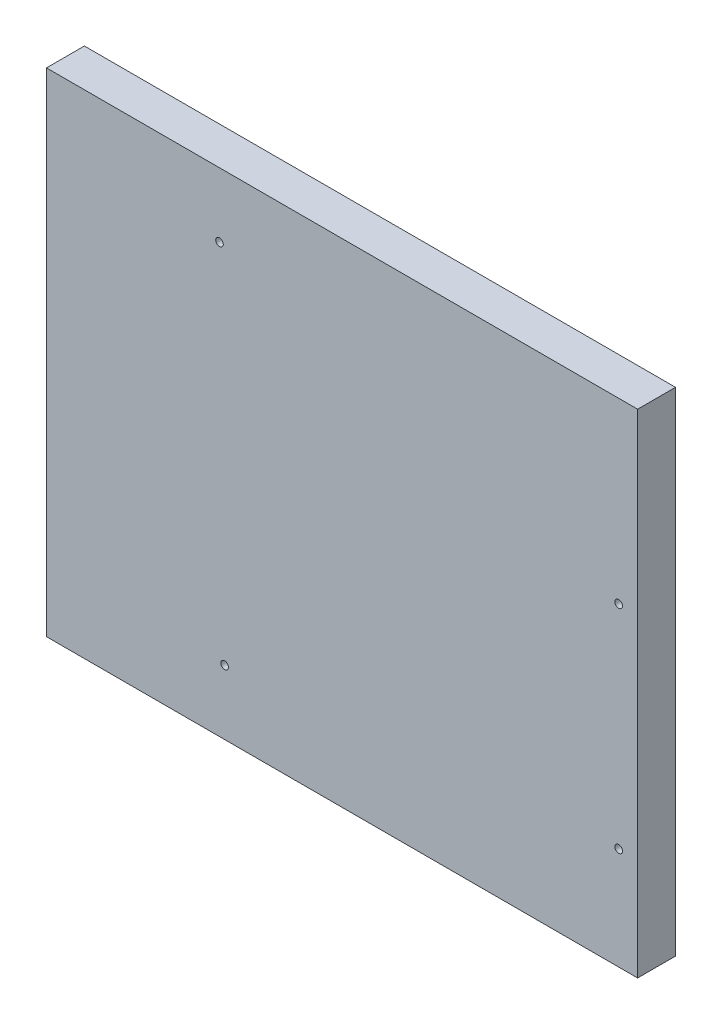
ISO-10303-21;
HEADER;
FILE_DESCRIPTION(('STEP AP214'),'2;1');
FILE_NAME('part.step','',(''),(''),'','','');
FILE_SCHEMA(('AUTOMOTIVE_DESIGN { 1 0 10303 214 1 1 1 1 }'));
ENDSEC;
DATA;
#1=APPLICATION_CONTEXT('core data for automotive mechanical design processes');
#2=APPLICATION_PROTOCOL_DEFINITION('international standard','automotive_design',2000,#1);
#3=PRODUCT_CONTEXT('',#1,'mechanical');
#4=PRODUCT('Part','Part','',(#3));
#5=PRODUCT_RELATED_PRODUCT_CATEGORY('part','',(#4));
#6=PRODUCT_DEFINITION_FORMATION('','',#4);
#7=PRODUCT_DEFINITION_CONTEXT('part definition',#1,'design');
#8=PRODUCT_DEFINITION('design','',#6,#7);
#9=PRODUCT_DEFINITION_SHAPE('','',#8);
#10=(LENGTH_UNIT() NAMED_UNIT(*) SI_UNIT(.MILLI.,.METRE.));
#11=(NAMED_UNIT(*) PLANE_ANGLE_UNIT() SI_UNIT($,.RADIAN.));
#12=(NAMED_UNIT(*) SI_UNIT($,.STERADIAN.) SOLID_ANGLE_UNIT());
#13=UNCERTAINTY_MEASURE_WITH_UNIT(LENGTH_MEASURE(1.E-05),#10,'distance_accuracy_value','');
#14=(GEOMETRIC_REPRESENTATION_CONTEXT(3) GLOBAL_UNCERTAINTY_ASSIGNED_CONTEXT((#13)) GLOBAL_UNIT_ASSIGNED_CONTEXT((#10,
#11,#12)) REPRESENTATION_CONTEXT('',''));
#15=CARTESIAN_POINT('',(0.,0.,0.));
#16=DIRECTION('',(0.,0.,1.));
#17=DIRECTION('',(1.,0.,0.));
#18=AXIS2_PLACEMENT_3D('',#15,#16,#17);
#19=CARTESIAN_POINT('',(0.,0.,5.));
#20=DIRECTION('',(1.,0.,0.));
#21=DIRECTION('',(0.,0.,-1.));
#22=AXIS2_PLACEMENT_3D('',#19,#20,#21);
#23=PLANE('',#22);
#24=DIRECTION('',(0.,-1.,0.));
#25=VECTOR('',#24,1.);
#26=CARTESIAN_POINT('',(0.,0.,0.));
#27=LINE('',#26,#25);
#28=CARTESIAN_POINT('',(0.,65.,0.));
#29=VERTEX_POINT('',#28);
#30=CARTESIAN_POINT('',(0.,0.,0.));
#31=VERTEX_POINT('',#30);
#32=EDGE_CURVE('E99',#29,#31,#27,.T.);
#33=ORIENTED_EDGE('',*,*,#32,.T.);
#34=DIRECTION('',(0.,0.,-1.));
#35=VECTOR('',#34,1.);
#36=CARTESIAN_POINT('',(0.,0.,5.));
#37=LINE('',#36,#35);
#38=CARTESIAN_POINT('',(0.,0.,5.));
#39=VERTEX_POINT('',#38);
#40=EDGE_CURVE('E11',#39,#31,#37,.T.);
#41=ORIENTED_EDGE('',*,*,#40,.F.);
#42=DIRECTION('',(0.,-1.,0.));
#43=VECTOR('',#42,1.);
#44=CARTESIAN_POINT('',(0.,0.,5.));
#45=LINE('',#44,#43);
#46=CARTESIAN_POINT('',(0.,65.,5.));
#47=VERTEX_POINT('',#46);
#48=EDGE_CURVE('E86',#47,#39,#45,.T.);
#49=ORIENTED_EDGE('',*,*,#48,.F.);
#50=DIRECTION('',(0.,0.,-1.));
#51=VECTOR('',#50,1.);
#52=CARTESIAN_POINT('',(0.,65.,5.));
#53=LINE('',#52,#51);
#54=EDGE_CURVE('E95',#47,#29,#53,.T.);
#55=ORIENTED_EDGE('',*,*,#54,.T.);
#56=EDGE_LOOP('',(#33,#41,#49,#55));
#57=FACE_BOUND('',#56,.T.);
#58=ADVANCED_FACE('F33',(#57),#23,.F.);
#59=CARTESIAN_POINT('',(0.,0.,5.));
#60=DIRECTION('',(0.,1.,0.));
#61=DIRECTION('',(0.,0.,1.));
#62=AXIS2_PLACEMENT_3D('',#59,#60,#61);
#63=PLANE('',#62);
#64=DIRECTION('',(1.,0.,0.));
#65=VECTOR('',#64,1.);
#66=CARTESIAN_POINT('',(0.,0.,0.));
#67=LINE('',#66,#65);
#68=CARTESIAN_POINT('',(78.,0.,0.));
#69=VERTEX_POINT('',#68);
#70=EDGE_CURVE('E90',#31,#69,#67,.T.);
#71=ORIENTED_EDGE('',*,*,#70,.T.);
#72=DIRECTION('',(0.,0.,-1.));
#73=VECTOR('',#72,1.);
#74=CARTESIAN_POINT('',(78.,0.,5.));
#75=LINE('',#74,#73);
#76=CARTESIAN_POINT('',(78.,0.,5.));
#77=VERTEX_POINT('',#76);
#78=EDGE_CURVE('E42',#77,#69,#75,.T.);
#79=ORIENTED_EDGE('',*,*,#78,.F.);
#80=DIRECTION('',(1.,0.,0.));
#81=VECTOR('',#80,1.);
#82=CARTESIAN_POINT('',(0.,0.,5.));
#83=LINE('',#82,#81);
#84=EDGE_CURVE('E81',#39,#77,#83,.T.);
#85=ORIENTED_EDGE('',*,*,#84,.F.);
#86=ORIENTED_EDGE('',*,*,#40,.T.);
#87=EDGE_LOOP('',(#71,#79,#85,#86));
#88=FACE_BOUND('',#87,.T.);
#89=ADVANCED_FACE('F89',(#88),#63,.F.);
#90=CARTESIAN_POINT('',(78.,0.,5.));
#91=DIRECTION('',(-1.,0.,0.));
#92=DIRECTION('',(0.,0.,1.));
#93=AXIS2_PLACEMENT_3D('',#90,#91,#92);
#94=PLANE('',#93);
#95=DIRECTION('',(0.,1.,0.));
#96=VECTOR('',#95,1.);
#97=CARTESIAN_POINT('',(78.,0.,0.));
#98=LINE('',#97,#96);
#99=CARTESIAN_POINT('',(78.,65.,0.));
#100=VERTEX_POINT('',#99);
#101=EDGE_CURVE('E68',#69,#100,#98,.T.);
#102=ORIENTED_EDGE('',*,*,#101,.T.);
#103=DIRECTION('',(0.,0.,-1.));
#104=VECTOR('',#103,1.);
#105=CARTESIAN_POINT('',(78.,65.,5.));
#106=LINE('',#105,#104);
#107=CARTESIAN_POINT('',(78.,65.,5.));
#108=VERTEX_POINT('',#107);
#109=EDGE_CURVE('E91',#108,#100,#106,.T.);
#110=ORIENTED_EDGE('',*,*,#109,.F.);
#111=DIRECTION('',(0.,1.,0.));
#112=VECTOR('',#111,1.);
#113=CARTESIAN_POINT('',(78.,0.,5.));
#114=LINE('',#113,#112);
#115=EDGE_CURVE('E84',#77,#108,#114,.T.);
#116=ORIENTED_EDGE('',*,*,#115,.F.);
#117=ORIENTED_EDGE('',*,*,#78,.T.);
#118=EDGE_LOOP('',(#102,#110,#116,#117));
#119=FACE_BOUND('',#118,.T.);
#120=ADVANCED_FACE('F93',(#119),#94,.F.);
#121=CARTESIAN_POINT('',(0.,65.,5.));
#122=DIRECTION('',(0.,-1.,0.));
#123=DIRECTION('',(0.,0.,-1.));
#124=AXIS2_PLACEMENT_3D('',#121,#122,#123);
#125=PLANE('',#124);
#126=DIRECTION('',(-1.,0.,0.));
#127=VECTOR('',#126,1.);
#128=CARTESIAN_POINT('',(0.,65.,0.));
#129=LINE('',#128,#127);
#130=EDGE_CURVE('E74',#100,#29,#129,.T.);
#131=ORIENTED_EDGE('',*,*,#130,.T.);
#132=ORIENTED_EDGE('',*,*,#54,.F.);
#133=DIRECTION('',(-1.,0.,0.));
#134=VECTOR('',#133,1.);
#135=CARTESIAN_POINT('',(0.,65.,5.));
#136=LINE('',#135,#134);
#137=EDGE_CURVE('E51',#108,#47,#136,.T.);
#138=ORIENTED_EDGE('',*,*,#137,.F.);
#139=ORIENTED_EDGE('',*,*,#109,.T.);
#140=EDGE_LOOP('',(#131,#132,#138,#139));
#141=FACE_BOUND('',#140,.T.);
#142=ADVANCED_FACE('F136',(#141),#125,.F.);
#143=CARTESIAN_POINT('',(0.,0.,5.));
#144=DIRECTION('',(0.,0.,-1.));
#145=DIRECTION('',(-1.,0.,0.));
#146=AXIS2_PLACEMENT_3D('',#143,#144,#145);
#147=PLANE('',#146);
#148=CARTESIAN_POINT('',(75.5,41.5,5.));
#149=DIRECTION('',(0.,0.,1.));
#150=DIRECTION('',(1.,0.,0.));
#151=AXIS2_PLACEMENT_3D('',#148,#149,#150);
#152=CIRCLE('',#151,0.499999999999999);
#153=CARTESIAN_POINT('',(76.,41.5,5.));
#154=VERTEX_POINT('',#153);
#155=EDGE_CURVE('E126',#154,#154,#152,.T.);
#156=ORIENTED_EDGE('',*,*,#155,.F.);
#157=EDGE_LOOP('',(#156));
#158=FACE_BOUND('',#157,.T.);
#159=CARTESIAN_POINT('',(75.5,13.5,5.));
#160=DIRECTION('',(0.,0.,1.));
#161=DIRECTION('',(1.,0.,0.));
#162=AXIS2_PLACEMENT_3D('',#159,#160,#161);
#163=CIRCLE('',#162,0.499999999999985);
#164=CARTESIAN_POINT('',(76.,13.5,5.));
#165=VERTEX_POINT('',#164);
#166=EDGE_CURVE('E116',#165,#165,#163,.T.);
#167=ORIENTED_EDGE('',*,*,#166,.F.);
#168=EDGE_LOOP('',(#167));
#169=FACE_BOUND('',#168,.T.);
#170=CARTESIAN_POINT('',(23.5,8.5,5.));
#171=DIRECTION('',(0.,0.,1.));
#172=DIRECTION('',(1.,0.,0.));
#173=AXIS2_PLACEMENT_3D('',#170,#171,#172);
#174=CIRCLE('',#173,0.499999999999999);
#175=CARTESIAN_POINT('',(24.,8.5,5.));
#176=VERTEX_POINT('',#175);
#177=EDGE_CURVE('E113',#176,#176,#174,.T.);
#178=ORIENTED_EDGE('',*,*,#177,.F.);
#179=EDGE_LOOP('',(#178));
#180=FACE_BOUND('',#179,.T.);
#181=CARTESIAN_POINT('',(22.8272209227886,56.5,5.));
#182=DIRECTION('',(0.,0.,1.));
#183=DIRECTION('',(1.,0.,0.));
#184=AXIS2_PLACEMENT_3D('',#181,#182,#183);
#185=CIRCLE('',#184,0.499999999999999);
#186=CARTESIAN_POINT('',(23.3272209227886,56.5,5.));
#187=VERTEX_POINT('',#186);
#188=EDGE_CURVE('E110',#187,#187,#185,.T.);
#189=ORIENTED_EDGE('',*,*,#188,.F.);
#190=EDGE_LOOP('',(#189));
#191=FACE_BOUND('',#190,.T.);
#192=ORIENTED_EDGE('',*,*,#48,.T.);
#193=ORIENTED_EDGE('',*,*,#84,.T.);
#194=ORIENTED_EDGE('',*,*,#115,.T.);
#195=ORIENTED_EDGE('',*,*,#137,.T.);
#196=EDGE_LOOP('',(#192,#193,#194,#195));
#197=FACE_BOUND('',#196,.T.);
#198=ADVANCED_FACE('F82',(#158,#169,#180,#191,#197),#147,.F.);
#199=CARTESIAN_POINT('',(0.,0.,0.));
#200=DIRECTION('',(0.,0.,-1.));
#201=DIRECTION('',(-1.,0.,0.));
#202=AXIS2_PLACEMENT_3D('',#199,#200,#201);
#203=PLANE('',#202);
#204=CARTESIAN_POINT('',(75.5,41.5,0.));
#205=DIRECTION('',(0.,0.,-1.));
#206=DIRECTION('',(-1.,0.,0.));
#207=AXIS2_PLACEMENT_3D('',#204,#205,#206);
#208=CIRCLE('',#207,0.499999999999999);
#209=CARTESIAN_POINT('',(75.,41.5,0.));
#210=VERTEX_POINT('',#209);
#211=EDGE_CURVE('E36',#210,#210,#208,.T.);
#212=ORIENTED_EDGE('',*,*,#211,.F.);
#213=EDGE_LOOP('',(#212));
#214=FACE_BOUND('',#213,.T.);
#215=CARTESIAN_POINT('',(75.5,13.5,0.));
#216=DIRECTION('',(0.,0.,-1.));
#217=DIRECTION('',(-1.,0.,0.));
#218=AXIS2_PLACEMENT_3D('',#215,#216,#217);
#219=CIRCLE('',#218,0.499999999999985);
#220=CARTESIAN_POINT('',(75.,13.5,0.));
#221=VERTEX_POINT('',#220);
#222=EDGE_CURVE('E114',#221,#221,#219,.T.);
#223=ORIENTED_EDGE('',*,*,#222,.F.);
#224=EDGE_LOOP('',(#223));
#225=FACE_BOUND('',#224,.T.);
#226=CARTESIAN_POINT('',(23.5,8.5,0.));
#227=DIRECTION('',(0.,0.,-1.));
#228=DIRECTION('',(-1.,0.,0.));
#229=AXIS2_PLACEMENT_3D('',#226,#227,#228);
#230=CIRCLE('',#229,0.499999999999999);
#231=CARTESIAN_POINT('',(23.,8.5,0.));
#232=VERTEX_POINT('',#231);
#233=EDGE_CURVE('E111',#232,#232,#230,.T.);
#234=ORIENTED_EDGE('',*,*,#233,.F.);
#235=EDGE_LOOP('',(#234));
#236=FACE_BOUND('',#235,.T.);
#237=CARTESIAN_POINT('',(22.8272209227886,56.5,0.));
#238=DIRECTION('',(0.,0.,-1.));
#239=DIRECTION('',(-1.,0.,0.));
#240=AXIS2_PLACEMENT_3D('',#237,#238,#239);
#241=CIRCLE('',#240,0.499999999999999);
#242=CARTESIAN_POINT('',(22.3272209227886,56.5,0.));
#243=VERTEX_POINT('',#242);
#244=EDGE_CURVE('E102',#243,#243,#241,.T.);
#245=ORIENTED_EDGE('',*,*,#244,.F.);
#246=EDGE_LOOP('',(#245));
#247=FACE_BOUND('',#246,.T.);
#248=ORIENTED_EDGE('',*,*,#32,.F.);
#249=ORIENTED_EDGE('',*,*,#130,.F.);
#250=ORIENTED_EDGE('',*,*,#101,.F.);
#251=ORIENTED_EDGE('',*,*,#70,.F.);
#252=EDGE_LOOP('',(#248,#249,#250,#251));
#253=FACE_BOUND('',#252,.T.);
#254=ADVANCED_FACE('F135',(#214,#225,#236,#247,#253),#203,.T.);
#255=CARTESIAN_POINT('',(22.8272209227886,56.5,-16.));
#256=DIRECTION('',(0.,0.,1.));
#257=DIRECTION('',(1.,0.,0.));
#258=AXIS2_PLACEMENT_3D('',#255,#256,#257);
#259=CYLINDRICAL_SURFACE('',#258,0.499999999999999);
#260=ORIENTED_EDGE('',*,*,#244,.T.);
#261=EDGE_LOOP('',(#260));
#262=FACE_BOUND('',#261,.T.);
#263=ORIENTED_EDGE('',*,*,#188,.T.);
#264=EDGE_LOOP('',(#263));
#265=FACE_BOUND('',#264,.T.);
#266=ADVANCED_FACE('F132',(#262,#265),#259,.F.);
#267=CARTESIAN_POINT('',(23.5,8.5,-16.));
#268=DIRECTION('',(0.,0.,1.));
#269=DIRECTION('',(1.,0.,0.));
#270=AXIS2_PLACEMENT_3D('',#267,#268,#269);
#271=CYLINDRICAL_SURFACE('',#270,0.499999999999999);
#272=ORIENTED_EDGE('',*,*,#233,.T.);
#273=EDGE_LOOP('',(#272));
#274=FACE_BOUND('',#273,.T.);
#275=ORIENTED_EDGE('',*,*,#177,.T.);
#276=EDGE_LOOP('',(#275));
#277=FACE_BOUND('',#276,.T.);
#278=ADVANCED_FACE('F185',(#274,#277),#271,.F.);
#279=CARTESIAN_POINT('',(75.5,13.5,-16.));
#280=DIRECTION('',(0.,0.,1.));
#281=DIRECTION('',(1.,0.,0.));
#282=AXIS2_PLACEMENT_3D('',#279,#280,#281);
#283=CYLINDRICAL_SURFACE('',#282,0.499999999999985);
#284=ORIENTED_EDGE('',*,*,#222,.T.);
#285=EDGE_LOOP('',(#284));
#286=FACE_BOUND('',#285,.T.);
#287=ORIENTED_EDGE('',*,*,#166,.T.);
#288=EDGE_LOOP('',(#287));
#289=FACE_BOUND('',#288,.T.);
#290=ADVANCED_FACE('F194',(#286,#289),#283,.F.);
#291=CARTESIAN_POINT('',(75.5,41.5,-16.));
#292=DIRECTION('',(0.,0.,1.));
#293=DIRECTION('',(1.,0.,0.));
#294=AXIS2_PLACEMENT_3D('',#291,#292,#293);
#295=CYLINDRICAL_SURFACE('',#294,0.499999999999999);
#296=ORIENTED_EDGE('',*,*,#211,.T.);
#297=EDGE_LOOP('',(#296));
#298=FACE_BOUND('',#297,.T.);
#299=ORIENTED_EDGE('',*,*,#155,.T.);
#300=EDGE_LOOP('',(#299));
#301=FACE_BOUND('',#300,.T.);
#302=ADVANCED_FACE('F204',(#298,#301),#295,.F.);
#303=CLOSED_SHELL('',(#58,#89,#120,#142,#198,#254,#266,#278,#290,#302));
#304=MANIFOLD_SOLID_BREP('B2',#303);
#305=ADVANCED_BREP_SHAPE_REPRESENTATION('',(#18,#304),#14);
#306=SHAPE_DEFINITION_REPRESENTATION(#9,#305);
ENDSEC;
END-ISO-10303-21;
